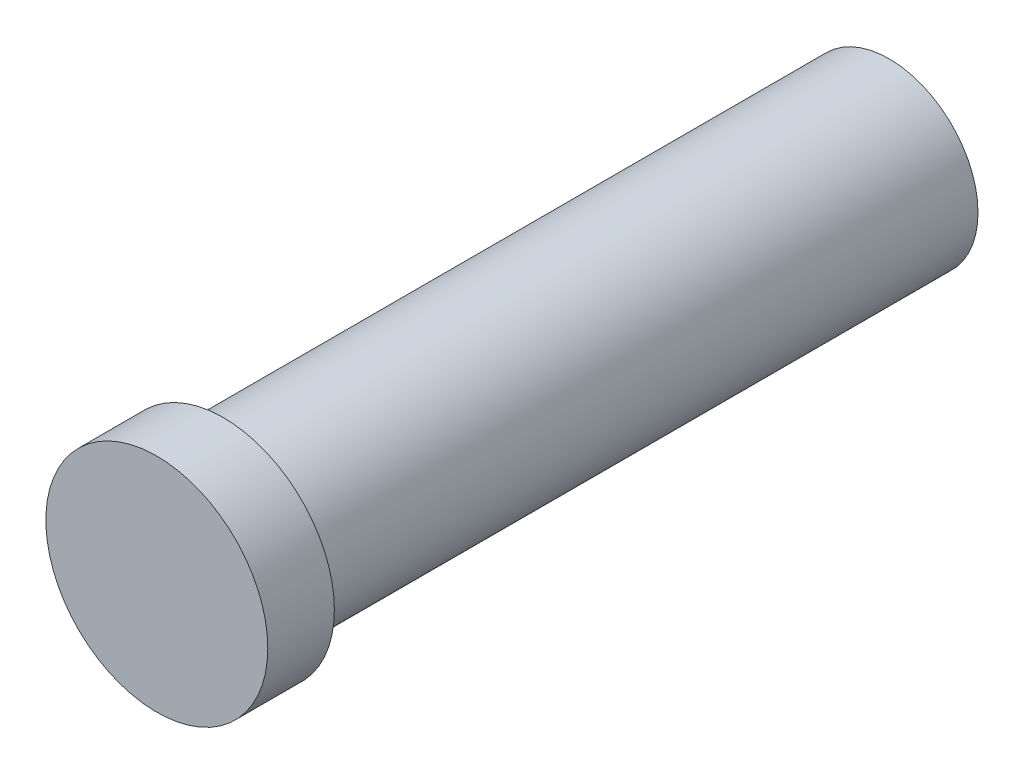
ISO-10303-21;
HEADER;
FILE_DESCRIPTION(('STEP AP214'),'2;1');
FILE_NAME('part.step','',(''),(''),'','','');
FILE_SCHEMA(('AUTOMOTIVE_DESIGN { 1 0 10303 214 1 1 1 1 }'));
ENDSEC;
DATA;
#1=APPLICATION_CONTEXT('core data for automotive mechanical design processes');
#2=APPLICATION_PROTOCOL_DEFINITION('international standard','automotive_design',2000,#1);
#3=PRODUCT_CONTEXT('',#1,'mechanical');
#4=PRODUCT('Part','Part','',(#3));
#5=PRODUCT_RELATED_PRODUCT_CATEGORY('part','',(#4));
#6=PRODUCT_DEFINITION_FORMATION('','',#4);
#7=PRODUCT_DEFINITION_CONTEXT('part definition',#1,'design');
#8=PRODUCT_DEFINITION('design','',#6,#7);
#9=PRODUCT_DEFINITION_SHAPE('','',#8);
#10=(LENGTH_UNIT() NAMED_UNIT(*) SI_UNIT(.MILLI.,.METRE.));
#11=(NAMED_UNIT(*) PLANE_ANGLE_UNIT() SI_UNIT($,.RADIAN.));
#12=(NAMED_UNIT(*) SI_UNIT($,.STERADIAN.) SOLID_ANGLE_UNIT());
#13=UNCERTAINTY_MEASURE_WITH_UNIT(LENGTH_MEASURE(1.E-05),#10,'distance_accuracy_value','');
#14=(GEOMETRIC_REPRESENTATION_CONTEXT(3) GLOBAL_UNCERTAINTY_ASSIGNED_CONTEXT((#13)) GLOBAL_UNIT_ASSIGNED_CONTEXT((#10,
#11,#12)) REPRESENTATION_CONTEXT('',''));
#15=CARTESIAN_POINT('',(0.,0.,0.));
#16=DIRECTION('',(0.,0.,1.));
#17=DIRECTION('',(1.,0.,0.));
#18=AXIS2_PLACEMENT_3D('',#15,#16,#17);
#19=CARTESIAN_POINT('',(0.,0.,33.));
#20=DIRECTION('',(0.,0.,-1.));
#21=DIRECTION('',(-1.,0.,0.));
#22=AXIS2_PLACEMENT_3D('',#19,#20,#21);
#23=CYLINDRICAL_SURFACE('',#22,4.);
#24=CARTESIAN_POINT('',(0.,0.,0.));
#25=DIRECTION('',(0.,0.,1.));
#26=DIRECTION('',(1.,0.,0.));
#27=AXIS2_PLACEMENT_3D('',#24,#25,#26);
#28=CIRCLE('',#27,4.);
#29=CARTESIAN_POINT('',(4.,0.,0.));
#30=VERTEX_POINT('',#29);
#31=EDGE_CURVE('E48',#30,#30,#28,.T.);
#32=ORIENTED_EDGE('',*,*,#31,.T.);
#33=EDGE_LOOP('',(#32));
#34=FACE_BOUND('',#33,.T.);
#35=CARTESIAN_POINT('',(0.,0.,30.));
#36=DIRECTION('',(0.,0.,1.));
#37=DIRECTION('',(1.,0.,0.));
#38=AXIS2_PLACEMENT_3D('',#35,#36,#37);
#39=CIRCLE('',#38,4.);
#40=CARTESIAN_POINT('',(4.,0.,30.));
#41=VERTEX_POINT('',#40);
#42=EDGE_CURVE('E10',#41,#41,#39,.T.);
#43=ORIENTED_EDGE('',*,*,#42,.F.);
#44=EDGE_LOOP('',(#43));
#45=FACE_BOUND('',#44,.T.);
#46=ADVANCED_FACE('F41',(#34,#45),#23,.T.);
#47=CARTESIAN_POINT('',(0.,0.,0.));
#48=DIRECTION('',(0.,0.,1.));
#49=DIRECTION('',(1.,0.,0.));
#50=AXIS2_PLACEMENT_3D('',#47,#48,#49);
#51=PLANE('',#50);
#52=ORIENTED_EDGE('',*,*,#31,.F.);
#53=EDGE_LOOP('',(#52));
#54=FACE_BOUND('',#53,.T.);
#55=ADVANCED_FACE('F70',(#54),#51,.F.);
#56=CARTESIAN_POINT('',(0.,0.,30.));
#57=DIRECTION('',(0.,0.,1.));
#58=DIRECTION('',(1.,0.,0.));
#59=AXIS2_PLACEMENT_3D('',#56,#57,#58);
#60=CYLINDRICAL_SURFACE('',#59,5.);
#61=CARTESIAN_POINT('',(0.,0.,30.));
#62=DIRECTION('',(0.,0.,1.));
#63=DIRECTION('',(1.,0.,0.));
#64=AXIS2_PLACEMENT_3D('',#61,#62,#63);
#65=CIRCLE('',#64,5.);
#66=CARTESIAN_POINT('',(5.,0.,30.));
#67=VERTEX_POINT('',#66);
#68=EDGE_CURVE('E53',#67,#67,#65,.T.);
#69=ORIENTED_EDGE('',*,*,#68,.T.);
#70=EDGE_LOOP('',(#69));
#71=FACE_BOUND('',#70,.T.);
#72=CARTESIAN_POINT('',(0.,0.,33.));
#73=DIRECTION('',(0.,0.,1.));
#74=DIRECTION('',(1.,0.,0.));
#75=AXIS2_PLACEMENT_3D('',#72,#73,#74);
#76=CIRCLE('',#75,5.);
#77=CARTESIAN_POINT('',(5.,0.,33.));
#78=VERTEX_POINT('',#77);
#79=EDGE_CURVE('E58',#78,#78,#76,.T.);
#80=ORIENTED_EDGE('',*,*,#79,.F.);
#81=EDGE_LOOP('',(#80));
#82=FACE_BOUND('',#81,.T.);
#83=ADVANCED_FACE('F67',(#71,#82),#60,.T.);
#84=CARTESIAN_POINT('',(0.,0.,30.));
#85=DIRECTION('',(0.,0.,1.));
#86=DIRECTION('',(1.,0.,0.));
#87=AXIS2_PLACEMENT_3D('',#84,#85,#86);
#88=PLANE('',#87);
#89=ORIENTED_EDGE('',*,*,#42,.T.);
#90=EDGE_LOOP('',(#89));
#91=FACE_BOUND('',#90,.T.);
#92=ORIENTED_EDGE('',*,*,#68,.F.);
#93=EDGE_LOOP('',(#92));
#94=FACE_BOUND('',#93,.T.);
#95=ADVANCED_FACE('F69',(#91,#94),#88,.F.);
#96=CARTESIAN_POINT('',(0.,0.,33.));
#97=DIRECTION('',(0.,0.,1.));
#98=DIRECTION('',(1.,0.,0.));
#99=AXIS2_PLACEMENT_3D('',#96,#97,#98);
#100=PLANE('',#99);
#101=ORIENTED_EDGE('',*,*,#79,.T.);
#102=EDGE_LOOP('',(#101));
#103=FACE_BOUND('',#102,.T.);
#104=ADVANCED_FACE('F65',(#103),#100,.T.);
#105=CLOSED_SHELL('',(#46,#55,#83,#95,#104));
#106=MANIFOLD_SOLID_BREP('B2',#105);
#107=ADVANCED_BREP_SHAPE_REPRESENTATION('',(#18,#106),#14);
#108=SHAPE_DEFINITION_REPRESENTATION(#9,#107);
ENDSEC;
END-ISO-10303-21;
